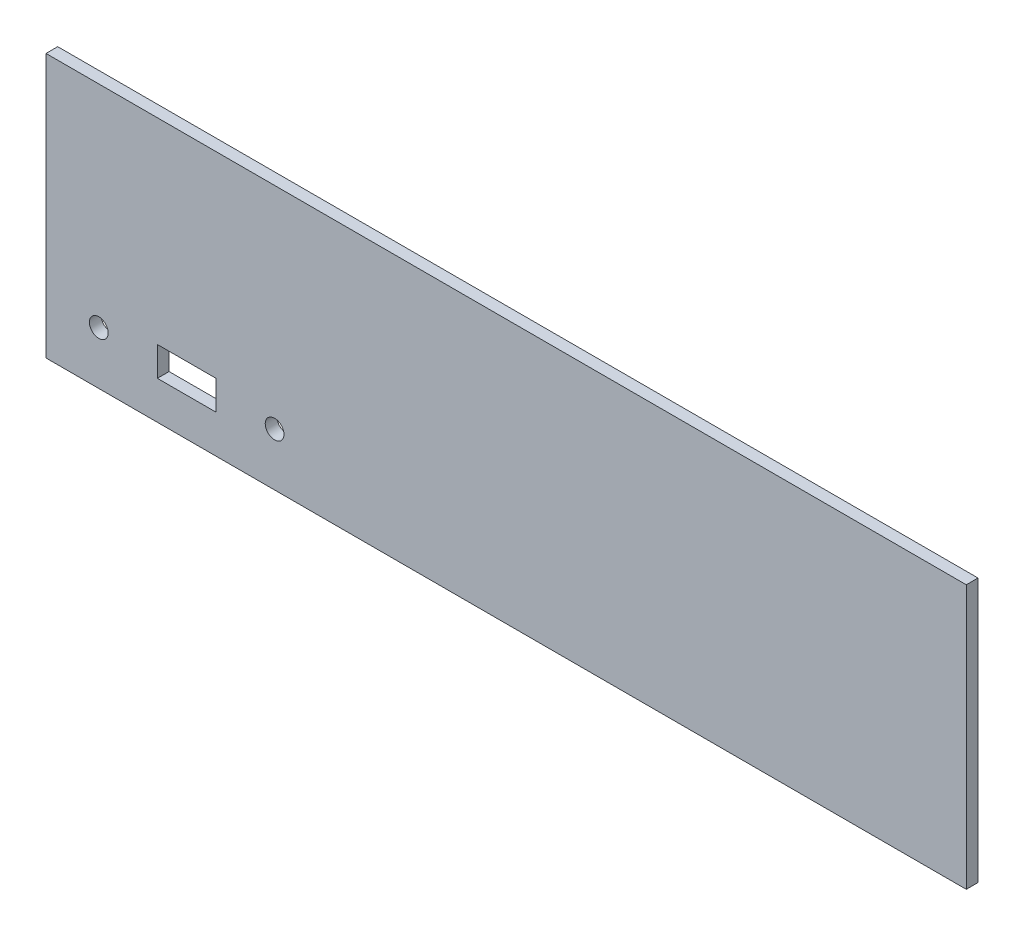
ISO-10303-21;
HEADER;
FILE_DESCRIPTION(('STEP AP214'),'2;1');
FILE_NAME('part.step','',(''),(''),'','','');
FILE_SCHEMA(('AUTOMOTIVE_DESIGN { 1 0 10303 214 1 1 1 1 }'));
ENDSEC;
DATA;
#1=APPLICATION_CONTEXT('core data for automotive mechanical design processes');
#2=APPLICATION_PROTOCOL_DEFINITION('international standard','automotive_design',2000,#1);
#3=PRODUCT_CONTEXT('',#1,'mechanical');
#4=PRODUCT('Part','Part','',(#3));
#5=PRODUCT_RELATED_PRODUCT_CATEGORY('part','',(#4));
#6=PRODUCT_DEFINITION_FORMATION('','',#4);
#7=PRODUCT_DEFINITION_CONTEXT('part definition',#1,'design');
#8=PRODUCT_DEFINITION('design','',#6,#7);
#9=PRODUCT_DEFINITION_SHAPE('','',#8);
#10=(LENGTH_UNIT() NAMED_UNIT(*) SI_UNIT(.MILLI.,.METRE.));
#11=(NAMED_UNIT(*) PLANE_ANGLE_UNIT() SI_UNIT($,.RADIAN.));
#12=(NAMED_UNIT(*) SI_UNIT($,.STERADIAN.) SOLID_ANGLE_UNIT());
#13=UNCERTAINTY_MEASURE_WITH_UNIT(LENGTH_MEASURE(1.E-05),#10,'distance_accuracy_value','');
#14=(GEOMETRIC_REPRESENTATION_CONTEXT(3) GLOBAL_UNCERTAINTY_ASSIGNED_CONTEXT((#13)) GLOBAL_UNIT_ASSIGNED_CONTEXT((#10,
#11,#12)) REPRESENTATION_CONTEXT('',''));
#15=CARTESIAN_POINT('',(0.,0.,0.));
#16=DIRECTION('',(0.,0.,1.));
#17=DIRECTION('',(1.,0.,0.));
#18=AXIS2_PLACEMENT_3D('',#15,#16,#17);
#19=CARTESIAN_POINT('',(78.5,22.5,2.));
#20=DIRECTION('',(-1.,0.,0.));
#21=DIRECTION('',(0.,0.,1.));
#22=AXIS2_PLACEMENT_3D('',#19,#20,#21);
#23=PLANE('',#22);
#24=DIRECTION('',(0.,1.,0.));
#25=VECTOR('',#24,1.);
#26=CARTESIAN_POINT('',(78.5,22.5,0.));
#27=LINE('',#26,#25);
#28=CARTESIAN_POINT('',(78.5,-22.5,0.));
#29=VERTEX_POINT('',#28);
#30=CARTESIAN_POINT('',(78.5,22.5,0.));
#31=VERTEX_POINT('',#30);
#32=EDGE_CURVE('E157',#29,#31,#27,.T.);
#33=ORIENTED_EDGE('',*,*,#32,.T.);
#34=DIRECTION('',(0.,0.,-1.));
#35=VECTOR('',#34,1.);
#36=CARTESIAN_POINT('',(78.5,22.5,2.));
#37=LINE('',#36,#35);
#38=CARTESIAN_POINT('',(78.5,22.5,2.));
#39=VERTEX_POINT('',#38);
#40=EDGE_CURVE('E12',#39,#31,#37,.T.);
#41=ORIENTED_EDGE('',*,*,#40,.F.);
#42=DIRECTION('',(0.,1.,0.));
#43=VECTOR('',#42,1.);
#44=CARTESIAN_POINT('',(78.5,22.5,2.));
#45=LINE('',#44,#43);
#46=CARTESIAN_POINT('',(78.5,-22.5,2.));
#47=VERTEX_POINT('',#46);
#48=EDGE_CURVE('E146',#47,#39,#45,.T.);
#49=ORIENTED_EDGE('',*,*,#48,.F.);
#50=DIRECTION('',(0.,0.,-1.));
#51=VECTOR('',#50,1.);
#52=CARTESIAN_POINT('',(78.5,-22.5,2.));
#53=LINE('',#52,#51);
#54=EDGE_CURVE('E156',#47,#29,#53,.T.);
#55=ORIENTED_EDGE('',*,*,#54,.T.);
#56=EDGE_LOOP('',(#33,#41,#49,#55));
#57=FACE_BOUND('',#56,.T.);
#58=ADVANCED_FACE('F39',(#57),#23,.F.);
#59=CARTESIAN_POINT('',(-78.5,22.5,2.));
#60=DIRECTION('',(0.,-1.,0.));
#61=DIRECTION('',(0.,0.,-1.));
#62=AXIS2_PLACEMENT_3D('',#59,#60,#61);
#63=PLANE('',#62);
#64=DIRECTION('',(-1.,0.,0.));
#65=VECTOR('',#64,1.);
#66=CARTESIAN_POINT('',(-78.5,22.5,0.));
#67=LINE('',#66,#65);
#68=CARTESIAN_POINT('',(-78.5,22.5,0.));
#69=VERTEX_POINT('',#68);
#70=EDGE_CURVE('E160',#31,#69,#67,.T.);
#71=ORIENTED_EDGE('',*,*,#70,.T.);
#72=DIRECTION('',(0.,0.,-1.));
#73=VECTOR('',#72,1.);
#74=CARTESIAN_POINT('',(-78.5,22.5,2.));
#75=LINE('',#74,#73);
#76=CARTESIAN_POINT('',(-78.5,22.5,2.));
#77=VERTEX_POINT('',#76);
#78=EDGE_CURVE('E46',#77,#69,#75,.T.);
#79=ORIENTED_EDGE('',*,*,#78,.F.);
#80=DIRECTION('',(-1.,0.,0.));
#81=VECTOR('',#80,1.);
#82=CARTESIAN_POINT('',(-78.5,22.5,2.));
#83=LINE('',#82,#81);
#84=EDGE_CURVE('E149',#39,#77,#83,.T.);
#85=ORIENTED_EDGE('',*,*,#84,.F.);
#86=ORIENTED_EDGE('',*,*,#40,.T.);
#87=EDGE_LOOP('',(#71,#79,#85,#86));
#88=FACE_BOUND('',#87,.T.);
#89=ADVANCED_FACE('F189',(#88),#63,.F.);
#90=CARTESIAN_POINT('',(-78.5,22.5,2.));
#91=DIRECTION('',(1.,0.,0.));
#92=DIRECTION('',(0.,1.,0.));
#93=AXIS2_PLACEMENT_3D('',#90,#91,#92);
#94=PLANE('',#93);
#95=DIRECTION('',(0.,-1.,0.));
#96=VECTOR('',#95,1.);
#97=CARTESIAN_POINT('',(-78.5,22.5,0.));
#98=LINE('',#97,#96);
#99=CARTESIAN_POINT('',(-78.4999999999999,-22.5,0.));
#100=VERTEX_POINT('',#99);
#101=EDGE_CURVE('E163',#69,#100,#98,.T.);
#102=ORIENTED_EDGE('',*,*,#101,.T.);
#103=DIRECTION('',(0.,0.,-1.));
#104=VECTOR('',#103,1.);
#105=CARTESIAN_POINT('',(-78.4999999999999,-22.5,2.));
#106=LINE('',#105,#104);
#107=CARTESIAN_POINT('',(-78.4999999999999,-22.5,2.));
#108=VERTEX_POINT('',#107);
#109=EDGE_CURVE('E168',#108,#100,#106,.T.);
#110=ORIENTED_EDGE('',*,*,#109,.F.);
#111=DIRECTION('',(0.,-1.,0.));
#112=VECTOR('',#111,1.);
#113=CARTESIAN_POINT('',(-78.5,22.5,2.));
#114=LINE('',#113,#112);
#115=EDGE_CURVE('E152',#77,#108,#114,.T.);
#116=ORIENTED_EDGE('',*,*,#115,.F.);
#117=ORIENTED_EDGE('',*,*,#78,.T.);
#118=EDGE_LOOP('',(#102,#110,#116,#117));
#119=FACE_BOUND('',#118,.T.);
#120=ADVANCED_FACE('F175',(#119),#94,.F.);
#121=CARTESIAN_POINT('',(-78.4999999999999,-22.5,2.));
#122=DIRECTION('',(0.,1.,0.));
#123=DIRECTION('',(0.,0.,1.));
#124=AXIS2_PLACEMENT_3D('',#121,#122,#123);
#125=PLANE('',#124);
#126=DIRECTION('',(1.,0.,0.));
#127=VECTOR('',#126,1.);
#128=CARTESIAN_POINT('',(-78.4999999999999,-22.5,0.));
#129=LINE('',#128,#127);
#130=EDGE_CURVE('E150',#100,#29,#129,.T.);
#131=ORIENTED_EDGE('',*,*,#130,.T.);
#132=ORIENTED_EDGE('',*,*,#54,.F.);
#133=DIRECTION('',(1.,0.,0.));
#134=VECTOR('',#133,1.);
#135=CARTESIAN_POINT('',(-78.4999999999999,-22.5,2.));
#136=LINE('',#135,#134);
#137=EDGE_CURVE('E154',#108,#47,#136,.T.);
#138=ORIENTED_EDGE('',*,*,#137,.F.);
#139=ORIENTED_EDGE('',*,*,#109,.T.);
#140=EDGE_LOOP('',(#131,#132,#138,#139));
#141=FACE_BOUND('',#140,.T.);
#142=ADVANCED_FACE('F182',(#141),#125,.F.);
#143=CARTESIAN_POINT('',(0.,0.,2.));
#144=DIRECTION('',(0.,0.,1.));
#145=DIRECTION('',(1.,0.,0.));
#146=AXIS2_PLACEMENT_3D('',#143,#144,#145);
#147=PLANE('',#146);
#148=CARTESIAN_POINT('',(-69.5,-13.5,2.));
#149=DIRECTION('',(0.,0.,1.));
#150=DIRECTION('',(1.,0.,0.));
#151=AXIS2_PLACEMENT_3D('',#148,#149,#150);
#152=CIRCLE('',#151,1.6);
#153=CARTESIAN_POINT('',(-67.9,-13.5,2.));
#154=VERTEX_POINT('',#153);
#155=EDGE_CURVE('E230',#154,#154,#152,.T.);
#156=ORIENTED_EDGE('',*,*,#155,.F.);
#157=EDGE_LOOP('',(#156));
#158=FACE_BOUND('',#157,.T.);
#159=CARTESIAN_POINT('',(-39.5,-13.5,2.));
#160=DIRECTION('',(0.,0.,1.));
#161=DIRECTION('',(-1.,0.,0.));
#162=AXIS2_PLACEMENT_3D('',#159,#160,#161);
#163=CIRCLE('',#162,1.6);
#164=CARTESIAN_POINT('',(-41.1,-13.5,2.));
#165=VERTEX_POINT('',#164);
#166=EDGE_CURVE('E127',#165,#165,#163,.T.);
#167=ORIENTED_EDGE('',*,*,#166,.F.);
#168=EDGE_LOOP('',(#167));
#169=FACE_BOUND('',#168,.T.);
#170=DIRECTION('',(0.,1.,0.));
#171=VECTOR('',#170,1.);
#172=CARTESIAN_POINT('',(-49.5,-11.,2.));
#173=LINE('',#172,#171);
#174=CARTESIAN_POINT('',(-49.5,-16.,2.));
#175=VERTEX_POINT('',#174);
#176=CARTESIAN_POINT('',(-49.5,-11.,2.));
#177=VERTEX_POINT('',#176);
#178=EDGE_CURVE('E53',#175,#177,#173,.T.);
#179=ORIENTED_EDGE('',*,*,#178,.F.);
#180=DIRECTION('',(1.,0.,0.));
#181=VECTOR('',#180,1.);
#182=CARTESIAN_POINT('',(-59.5,-16.,2.));
#183=LINE('',#182,#181);
#184=CARTESIAN_POINT('',(-59.5,-16.,2.));
#185=VERTEX_POINT('',#184);
#186=EDGE_CURVE('E121',#185,#175,#183,.T.);
#187=ORIENTED_EDGE('',*,*,#186,.F.);
#188=DIRECTION('',(0.,-1.,0.));
#189=VECTOR('',#188,1.);
#190=CARTESIAN_POINT('',(-59.5,-11.,2.));
#191=LINE('',#190,#189);
#192=CARTESIAN_POINT('',(-59.5,-11.,2.));
#193=VERTEX_POINT('',#192);
#194=EDGE_CURVE('E124',#193,#185,#191,.T.);
#195=ORIENTED_EDGE('',*,*,#194,.F.);
#196=DIRECTION('',(-1.,0.,0.));
#197=VECTOR('',#196,1.);
#198=CARTESIAN_POINT('',(-59.5,-11.,2.));
#199=LINE('',#198,#197);
#200=EDGE_CURVE('E134',#177,#193,#199,.T.);
#201=ORIENTED_EDGE('',*,*,#200,.F.);
#202=EDGE_LOOP('',(#179,#187,#195,#201));
#203=FACE_BOUND('',#202,.T.);
#204=ORIENTED_EDGE('',*,*,#48,.T.);
#205=ORIENTED_EDGE('',*,*,#84,.T.);
#206=ORIENTED_EDGE('',*,*,#115,.T.);
#207=ORIENTED_EDGE('',*,*,#137,.T.);
#208=EDGE_LOOP('',(#204,#205,#206,#207));
#209=FACE_BOUND('',#208,.T.);
#210=ADVANCED_FACE('F188',(#158,#169,#203,#209),#147,.T.);
#211=CARTESIAN_POINT('',(0.,0.,0.));
#212=DIRECTION('',(0.,0.,1.));
#213=DIRECTION('',(1.,0.,0.));
#214=AXIS2_PLACEMENT_3D('',#211,#212,#213);
#215=PLANE('',#214);
#216=CARTESIAN_POINT('',(-69.5,-13.5,0.));
#217=DIRECTION('',(0.,0.,1.));
#218=DIRECTION('',(1.,0.,0.));
#219=AXIS2_PLACEMENT_3D('',#216,#217,#218);
#220=CIRCLE('',#219,1.6);
#221=CARTESIAN_POINT('',(-67.9,-13.5,0.));
#222=VERTEX_POINT('',#221);
#223=EDGE_CURVE('E161',#222,#222,#220,.T.);
#224=ORIENTED_EDGE('',*,*,#223,.T.);
#225=EDGE_LOOP('',(#224));
#226=FACE_BOUND('',#225,.T.);
#227=CARTESIAN_POINT('',(-39.5,-13.5,0.));
#228=DIRECTION('',(0.,0.,1.));
#229=DIRECTION('',(-1.,0.,0.));
#230=AXIS2_PLACEMENT_3D('',#227,#228,#229);
#231=CIRCLE('',#230,1.6);
#232=CARTESIAN_POINT('',(-41.1,-13.5,0.));
#233=VERTEX_POINT('',#232);
#234=EDGE_CURVE('E232',#233,#233,#231,.T.);
#235=ORIENTED_EDGE('',*,*,#234,.T.);
#236=EDGE_LOOP('',(#235));
#237=FACE_BOUND('',#236,.T.);
#238=DIRECTION('',(1.,0.,0.));
#239=VECTOR('',#238,1.);
#240=CARTESIAN_POINT('',(-59.5,-16.,0.));
#241=LINE('',#240,#239);
#242=CARTESIAN_POINT('',(-59.5,-16.,0.));
#243=VERTEX_POINT('',#242);
#244=CARTESIAN_POINT('',(-49.5,-16.,0.));
#245=VERTEX_POINT('',#244);
#246=EDGE_CURVE('E111',#243,#245,#241,.T.);
#247=ORIENTED_EDGE('',*,*,#246,.T.);
#248=DIRECTION('',(0.,1.,0.));
#249=VECTOR('',#248,1.);
#250=CARTESIAN_POINT('',(-49.5,-11.,0.));
#251=LINE('',#250,#249);
#252=CARTESIAN_POINT('',(-49.5,-11.,0.));
#253=VERTEX_POINT('',#252);
#254=EDGE_CURVE('E105',#245,#253,#251,.T.);
#255=ORIENTED_EDGE('',*,*,#254,.T.);
#256=DIRECTION('',(-1.,0.,0.));
#257=VECTOR('',#256,1.);
#258=CARTESIAN_POINT('',(-59.5,-11.,0.));
#259=LINE('',#258,#257);
#260=CARTESIAN_POINT('',(-59.5,-11.,0.));
#261=VERTEX_POINT('',#260);
#262=EDGE_CURVE('E114',#253,#261,#259,.T.);
#263=ORIENTED_EDGE('',*,*,#262,.T.);
#264=DIRECTION('',(0.,-1.,0.));
#265=VECTOR('',#264,1.);
#266=CARTESIAN_POINT('',(-59.5,-11.,0.));
#267=LINE('',#266,#265);
#268=EDGE_CURVE('E61',#261,#243,#267,.T.);
#269=ORIENTED_EDGE('',*,*,#268,.T.);
#270=EDGE_LOOP('',(#247,#255,#263,#269));
#271=FACE_BOUND('',#270,.T.);
#272=ORIENTED_EDGE('',*,*,#32,.F.);
#273=ORIENTED_EDGE('',*,*,#130,.F.);
#274=ORIENTED_EDGE('',*,*,#101,.F.);
#275=ORIENTED_EDGE('',*,*,#70,.F.);
#276=EDGE_LOOP('',(#272,#273,#274,#275));
#277=FACE_BOUND('',#276,.T.);
#278=ADVANCED_FACE('F118',(#226,#237,#271,#277),#215,.F.);
#279=CARTESIAN_POINT('',(-49.5,-11.,0.));
#280=DIRECTION('',(1.,0.,0.));
#281=DIRECTION('',(0.,0.,-1.));
#282=AXIS2_PLACEMENT_3D('',#279,#280,#281);
#283=PLANE('',#282);
#284=ORIENTED_EDGE('',*,*,#178,.T.);
#285=DIRECTION('',(0.,0.,1.));
#286=VECTOR('',#285,1.);
#287=CARTESIAN_POINT('',(-49.5,-11.,0.));
#288=LINE('',#287,#286);
#289=EDGE_CURVE('E101',#253,#177,#288,.T.);
#290=ORIENTED_EDGE('',*,*,#289,.F.);
#291=ORIENTED_EDGE('',*,*,#254,.F.);
#292=DIRECTION('',(0.,0.,1.));
#293=VECTOR('',#292,1.);
#294=CARTESIAN_POINT('',(-49.5,-16.,0.));
#295=LINE('',#294,#293);
#296=EDGE_CURVE('E141',#245,#175,#295,.T.);
#297=ORIENTED_EDGE('',*,*,#296,.T.);
#298=EDGE_LOOP('',(#284,#290,#291,#297));
#299=FACE_BOUND('',#298,.T.);
#300=ADVANCED_FACE('F103',(#299),#283,.F.);
#301=CARTESIAN_POINT('',(-59.5,-16.,0.));
#302=DIRECTION('',(0.,-1.,0.));
#303=DIRECTION('',(0.,0.,-1.));
#304=AXIS2_PLACEMENT_3D('',#301,#302,#303);
#305=PLANE('',#304);
#306=ORIENTED_EDGE('',*,*,#186,.T.);
#307=ORIENTED_EDGE('',*,*,#296,.F.);
#308=ORIENTED_EDGE('',*,*,#246,.F.);
#309=DIRECTION('',(0.,0.,1.));
#310=VECTOR('',#309,1.);
#311=CARTESIAN_POINT('',(-59.5,-16.,0.));
#312=LINE('',#311,#310);
#313=EDGE_CURVE('E143',#243,#185,#312,.T.);
#314=ORIENTED_EDGE('',*,*,#313,.T.);
#315=EDGE_LOOP('',(#306,#307,#308,#314));
#316=FACE_BOUND('',#315,.T.);
#317=ADVANCED_FACE('F207',(#316),#305,.F.);
#318=CARTESIAN_POINT('',(-59.5,-11.,0.));
#319=DIRECTION('',(-1.,0.,0.));
#320=DIRECTION('',(0.,0.,1.));
#321=AXIS2_PLACEMENT_3D('',#318,#319,#320);
#322=PLANE('',#321);
#323=ORIENTED_EDGE('',*,*,#194,.T.);
#324=ORIENTED_EDGE('',*,*,#313,.F.);
#325=ORIENTED_EDGE('',*,*,#268,.F.);
#326=DIRECTION('',(0.,0.,1.));
#327=VECTOR('',#326,1.);
#328=CARTESIAN_POINT('',(-59.5,-11.,0.));
#329=LINE('',#328,#327);
#330=EDGE_CURVE('E110',#261,#193,#329,.T.);
#331=ORIENTED_EDGE('',*,*,#330,.T.);
#332=EDGE_LOOP('',(#323,#324,#325,#331));
#333=FACE_BOUND('',#332,.T.);
#334=ADVANCED_FACE('F211',(#333),#322,.F.);
#335=CARTESIAN_POINT('',(-59.5,-11.,0.));
#336=DIRECTION('',(0.,1.,0.));
#337=DIRECTION('',(-1.,0.,0.));
#338=AXIS2_PLACEMENT_3D('',#335,#336,#337);
#339=PLANE('',#338);
#340=ORIENTED_EDGE('',*,*,#200,.T.);
#341=ORIENTED_EDGE('',*,*,#330,.F.);
#342=ORIENTED_EDGE('',*,*,#262,.F.);
#343=ORIENTED_EDGE('',*,*,#289,.T.);
#344=EDGE_LOOP('',(#340,#341,#342,#343));
#345=FACE_BOUND('',#344,.T.);
#346=ADVANCED_FACE('F115',(#345),#339,.F.);
#347=CARTESIAN_POINT('',(-39.5,-13.5,0.));
#348=DIRECTION('',(0.,0.,1.));
#349=DIRECTION('',(1.,0.,0.));
#350=AXIS2_PLACEMENT_3D('',#347,#348,#349);
#351=CYLINDRICAL_SURFACE('',#350,1.6);
#352=ORIENTED_EDGE('',*,*,#234,.F.);
#353=EDGE_LOOP('',(#352));
#354=FACE_BOUND('',#353,.T.);
#355=ORIENTED_EDGE('',*,*,#166,.T.);
#356=EDGE_LOOP('',(#355));
#357=FACE_BOUND('',#356,.T.);
#358=ADVANCED_FACE('F210',(#354,#357),#351,.F.);
#359=CARTESIAN_POINT('',(-69.5,-13.5,0.));
#360=DIRECTION('',(0.,0.,1.));
#361=DIRECTION('',(1.,0.,0.));
#362=AXIS2_PLACEMENT_3D('',#359,#360,#361);
#363=CYLINDRICAL_SURFACE('',#362,1.6);
#364=ORIENTED_EDGE('',*,*,#223,.F.);
#365=EDGE_LOOP('',(#364));
#366=FACE_BOUND('',#365,.T.);
#367=ORIENTED_EDGE('',*,*,#155,.T.);
#368=EDGE_LOOP('',(#367));
#369=FACE_BOUND('',#368,.T.);
#370=ADVANCED_FACE('F219',(#366,#369),#363,.F.);
#371=CLOSED_SHELL('',(#58,#89,#120,#142,#210,#278,#300,#317,#334,#346,#358,#370));
#372=MANIFOLD_SOLID_BREP('B2',#371);
#373=ADVANCED_BREP_SHAPE_REPRESENTATION('',(#18,#372),#14);
#374=SHAPE_DEFINITION_REPRESENTATION(#9,#373);
ENDSEC;
END-ISO-10303-21;
